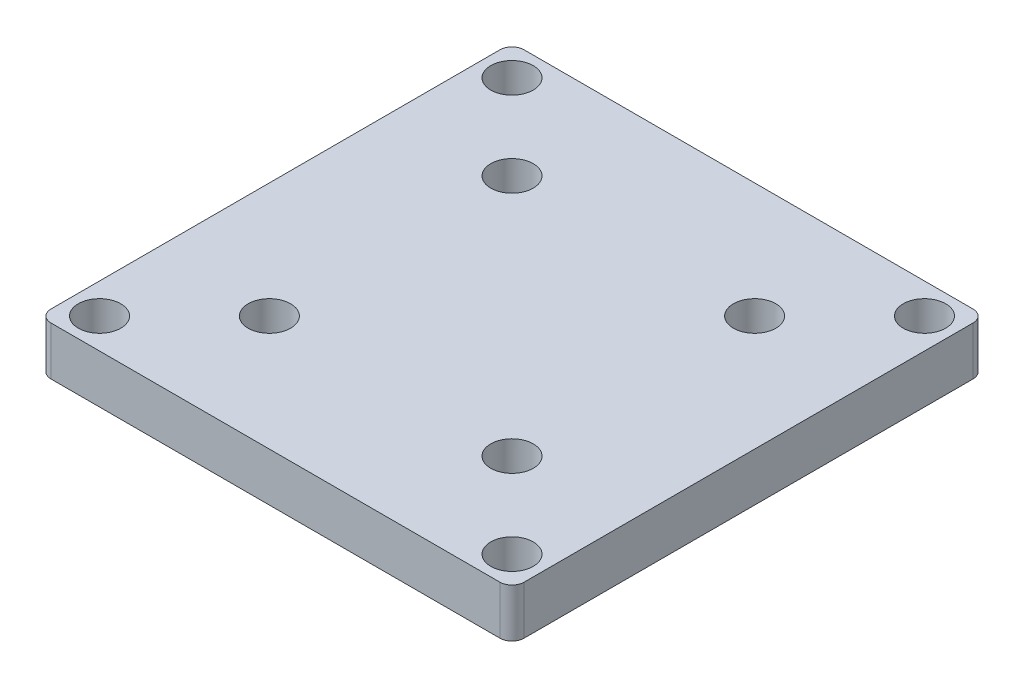
ISO-10303-21;
HEADER;
FILE_DESCRIPTION(('STEP AP214'),'2;1');
FILE_NAME('part.step','',(''),(''),'','','');
FILE_SCHEMA(('AUTOMOTIVE_DESIGN { 1 0 10303 214 1 1 1 1 }'));
ENDSEC;
DATA;
#1=APPLICATION_CONTEXT('core data for automotive mechanical design processes');
#2=APPLICATION_PROTOCOL_DEFINITION('international standard','automotive_design',2000,#1);
#3=PRODUCT_CONTEXT('',#1,'mechanical');
#4=PRODUCT('Part','Part','',(#3));
#5=PRODUCT_RELATED_PRODUCT_CATEGORY('part','',(#4));
#6=PRODUCT_DEFINITION_FORMATION('','',#4);
#7=PRODUCT_DEFINITION_CONTEXT('part definition',#1,'design');
#8=PRODUCT_DEFINITION('design','',#6,#7);
#9=PRODUCT_DEFINITION_SHAPE('','',#8);
#10=(LENGTH_UNIT() NAMED_UNIT(*) SI_UNIT(.MILLI.,.METRE.));
#11=(NAMED_UNIT(*) PLANE_ANGLE_UNIT() SI_UNIT($,.RADIAN.));
#12=(NAMED_UNIT(*) SI_UNIT($,.STERADIAN.) SOLID_ANGLE_UNIT());
#13=UNCERTAINTY_MEASURE_WITH_UNIT(LENGTH_MEASURE(1.E-05),#10,'distance_accuracy_value','');
#14=(GEOMETRIC_REPRESENTATION_CONTEXT(3) GLOBAL_UNCERTAINTY_ASSIGNED_CONTEXT((#13)) GLOBAL_UNIT_ASSIGNED_CONTEXT((#10,
#11,#12)) REPRESENTATION_CONTEXT('',''));
#15=CARTESIAN_POINT('',(0.,0.,0.));
#16=DIRECTION('',(0.,0.,1.));
#17=DIRECTION('',(1.,0.,0.));
#18=AXIS2_PLACEMENT_3D('',#15,#16,#17);
#19=CARTESIAN_POINT('',(0.,4.,0.));
#20=DIRECTION('',(0.,-1.,0.));
#21=DIRECTION('',(0.,0.,-1.));
#22=AXIS2_PLACEMENT_3D('',#19,#20,#21);
#23=PLANE('',#22);
#24=CARTESIAN_POINT('',(-10.,4.,-9.99999999999917));
#25=DIRECTION('',(0.,1.,0.));
#26=DIRECTION('',(0.,0.,1.));
#27=AXIS2_PLACEMENT_3D('',#24,#25,#26);
#28=CIRCLE('',#27,1.75);
#29=CARTESIAN_POINT('',(-10.,4.,-8.24999999999917));
#30=VERTEX_POINT('',#29);
#31=EDGE_CURVE('E217',#30,#30,#28,.T.);
#32=ORIENTED_EDGE('',*,*,#31,.F.);
#33=EDGE_LOOP('',(#32));
#34=FACE_BOUND('',#33,.T.);
#35=CARTESIAN_POINT('',(-9.99999999999917,4.,10.0000000000008));
#36=DIRECTION('',(0.,1.,0.));
#37=DIRECTION('',(0.,0.,1.));
#38=AXIS2_PLACEMENT_3D('',#35,#36,#37);
#39=CIRCLE('',#38,1.75);
#40=CARTESIAN_POINT('',(-9.99999999999917,4.,11.7500000000008));
#41=VERTEX_POINT('',#40);
#42=EDGE_CURVE('E220',#41,#41,#39,.T.);
#43=ORIENTED_EDGE('',*,*,#42,.F.);
#44=EDGE_LOOP('',(#43));
#45=FACE_BOUND('',#44,.T.);
#46=CARTESIAN_POINT('',(10.0000000000008,4.,10.));
#47=DIRECTION('',(0.,1.,0.));
#48=DIRECTION('',(0.,0.,1.));
#49=AXIS2_PLACEMENT_3D('',#46,#47,#48);
#50=CIRCLE('',#49,1.75);
#51=CARTESIAN_POINT('',(10.0000000000008,4.,11.75));
#52=VERTEX_POINT('',#51);
#53=EDGE_CURVE('E216',#52,#52,#50,.T.);
#54=ORIENTED_EDGE('',*,*,#53,.F.);
#55=EDGE_LOOP('',(#54));
#56=FACE_BOUND('',#55,.T.);
#57=CARTESIAN_POINT('',(10.,4.,-10.));
#58=DIRECTION('',(0.,1.,0.));
#59=DIRECTION('',(0.,0.,1.));
#60=AXIS2_PLACEMENT_3D('',#57,#58,#59);
#61=CIRCLE('',#60,1.75);
#62=CARTESIAN_POINT('',(10.,4.,-8.25));
#63=VERTEX_POINT('',#62);
#64=EDGE_CURVE('E145',#63,#63,#61,.T.);
#65=ORIENTED_EDGE('',*,*,#64,.F.);
#66=EDGE_LOOP('',(#65));
#67=FACE_BOUND('',#66,.T.);
#68=DIRECTION('',(0.,0.,1.));
#69=VECTOR('',#68,1.);
#70=CARTESIAN_POINT('',(-19.5,4.,19.5));
#71=LINE('',#70,#69);
#72=CARTESIAN_POINT('',(-19.5,4.,-18.5));
#73=VERTEX_POINT('',#72);
#74=CARTESIAN_POINT('',(-19.5,4.,18.5));
#75=VERTEX_POINT('',#74);
#76=EDGE_CURVE('E191',#73,#75,#71,.T.);
#77=ORIENTED_EDGE('',*,*,#76,.T.);
#78=CARTESIAN_POINT('',(-18.5,4.,18.5));
#79=DIRECTION('',(0.,-1.,0.));
#80=DIRECTION('',(0.,0.,-1.));
#81=AXIS2_PLACEMENT_3D('',#78,#79,#80);
#82=CIRCLE('',#81,1.);
#83=CARTESIAN_POINT('',(-18.5,4.,19.5));
#84=VERTEX_POINT('',#83);
#85=EDGE_CURVE('E168',#75,#84,#82,.F.);
#86=ORIENTED_EDGE('',*,*,#85,.T.);
#87=DIRECTION('',(1.,0.,0.));
#88=VECTOR('',#87,1.);
#89=CARTESIAN_POINT('',(-19.5,4.,19.5));
#90=LINE('',#89,#88);
#91=CARTESIAN_POINT('',(18.5,4.,19.5));
#92=VERTEX_POINT('',#91);
#93=EDGE_CURVE('E125',#84,#92,#90,.T.);
#94=ORIENTED_EDGE('',*,*,#93,.T.);
#95=CARTESIAN_POINT('',(18.5,4.,18.5));
#96=DIRECTION('',(0.,-1.,0.));
#97=DIRECTION('',(0.,0.,-1.));
#98=AXIS2_PLACEMENT_3D('',#95,#96,#97);
#99=CIRCLE('',#98,1.);
#100=CARTESIAN_POINT('',(19.5,4.,18.5));
#101=VERTEX_POINT('',#100);
#102=EDGE_CURVE('E163',#92,#101,#99,.F.);
#103=ORIENTED_EDGE('',*,*,#102,.T.);
#104=DIRECTION('',(0.,0.,-1.));
#105=VECTOR('',#104,1.);
#106=CARTESIAN_POINT('',(19.5,4.,19.5));
#107=LINE('',#106,#105);
#108=CARTESIAN_POINT('',(19.5,4.,-18.5));
#109=VERTEX_POINT('',#108);
#110=EDGE_CURVE('E132',#101,#109,#107,.T.);
#111=ORIENTED_EDGE('',*,*,#110,.T.);
#112=CARTESIAN_POINT('',(18.5,4.,-18.5));
#113=DIRECTION('',(0.,-1.,0.));
#114=DIRECTION('',(0.,0.,-1.));
#115=AXIS2_PLACEMENT_3D('',#112,#113,#114);
#116=CIRCLE('',#115,1.);
#117=CARTESIAN_POINT('',(18.5,4.,-19.5));
#118=VERTEX_POINT('',#117);
#119=EDGE_CURVE('E61',#109,#118,#116,.F.);
#120=ORIENTED_EDGE('',*,*,#119,.T.);
#121=DIRECTION('',(-1.,0.,0.));
#122=VECTOR('',#121,1.);
#123=CARTESIAN_POINT('',(-19.5,4.,-19.5));
#124=LINE('',#123,#122);
#125=CARTESIAN_POINT('',(-18.5,4.,-19.5));
#126=VERTEX_POINT('',#125);
#127=EDGE_CURVE('E135',#118,#126,#124,.T.);
#128=ORIENTED_EDGE('',*,*,#127,.T.);
#129=CARTESIAN_POINT('',(-18.5,4.,-18.5));
#130=DIRECTION('',(0.,-1.,0.));
#131=DIRECTION('',(0.,0.,-1.));
#132=AXIS2_PLACEMENT_3D('',#129,#130,#131);
#133=CIRCLE('',#132,1.);
#134=EDGE_CURVE('E166',#126,#73,#133,.F.);
#135=ORIENTED_EDGE('',*,*,#134,.T.);
#136=EDGE_LOOP('',(#77,#86,#94,#103,#111,#120,#128,#135));
#137=FACE_BOUND('',#136,.T.);
#138=CARTESIAN_POINT('',(17.,4.,-17.));
#139=DIRECTION('',(0.,1.,0.));
#140=DIRECTION('',(0.,0.,1.));
#141=AXIS2_PLACEMENT_3D('',#138,#139,#140);
#142=CIRCLE('',#141,1.75);
#143=CARTESIAN_POINT('',(17.,4.,-15.25));
#144=VERTEX_POINT('',#143);
#145=EDGE_CURVE('E184',#144,#144,#142,.T.);
#146=ORIENTED_EDGE('',*,*,#145,.F.);
#147=EDGE_LOOP('',(#146));
#148=FACE_BOUND('',#147,.T.);
#149=CARTESIAN_POINT('',(17.0000000000012,4.,17.));
#150=DIRECTION('',(0.,1.,0.));
#151=DIRECTION('',(0.,0.,1.));
#152=AXIS2_PLACEMENT_3D('',#149,#150,#151);
#153=CIRCLE('',#152,1.75);
#154=CARTESIAN_POINT('',(17.0000000000012,4.,18.75));
#155=VERTEX_POINT('',#154);
#156=EDGE_CURVE('E196',#155,#155,#153,.T.);
#157=ORIENTED_EDGE('',*,*,#156,.F.);
#158=EDGE_LOOP('',(#157));
#159=FACE_BOUND('',#158,.T.);
#160=CARTESIAN_POINT('',(-16.9999999999988,4.,17.0000000000012));
#161=DIRECTION('',(0.,1.,0.));
#162=DIRECTION('',(0.,0.,1.));
#163=AXIS2_PLACEMENT_3D('',#160,#161,#162);
#164=CIRCLE('',#163,1.75);
#165=CARTESIAN_POINT('',(-16.9999999999988,4.,18.7500000000012));
#166=VERTEX_POINT('',#165);
#167=EDGE_CURVE('E201',#166,#166,#164,.T.);
#168=ORIENTED_EDGE('',*,*,#167,.F.);
#169=EDGE_LOOP('',(#168));
#170=FACE_BOUND('',#169,.T.);
#171=CARTESIAN_POINT('',(-17.,4.,-16.9999999999988));
#172=DIRECTION('',(0.,1.,0.));
#173=DIRECTION('',(0.,0.,1.));
#174=AXIS2_PLACEMENT_3D('',#171,#172,#173);
#175=CIRCLE('',#174,1.75);
#176=CARTESIAN_POINT('',(-17.,4.,-15.2499999999988));
#177=VERTEX_POINT('',#176);
#178=EDGE_CURVE('E207',#177,#177,#175,.T.);
#179=ORIENTED_EDGE('',*,*,#178,.F.);
#180=EDGE_LOOP('',(#179));
#181=FACE_BOUND('',#180,.T.);
#182=ADVANCED_FACE('F39',(#34,#45,#56,#67,#137,#148,#159,#170,#181),#23,.F.);
#183=CARTESIAN_POINT('',(0.,0.,0.));
#184=DIRECTION('',(0.,-1.,0.));
#185=DIRECTION('',(0.,0.,-1.));
#186=AXIS2_PLACEMENT_3D('',#183,#184,#185);
#187=PLANE('',#186);
#188=CARTESIAN_POINT('',(-10.,0.,-9.99999999999917));
#189=DIRECTION('',(0.,-1.,0.));
#190=DIRECTION('',(0.,0.,-1.));
#191=AXIS2_PLACEMENT_3D('',#188,#189,#190);
#192=CIRCLE('',#191,1.75);
#193=CARTESIAN_POINT('',(-10.,0.,-11.7499999999992));
#194=VERTEX_POINT('',#193);
#195=EDGE_CURVE('E151',#194,#194,#192,.T.);
#196=ORIENTED_EDGE('',*,*,#195,.F.);
#197=EDGE_LOOP('',(#196));
#198=FACE_BOUND('',#197,.T.);
#199=CARTESIAN_POINT('',(-9.99999999999917,0.,10.0000000000008));
#200=DIRECTION('',(0.,-1.,0.));
#201=DIRECTION('',(0.,0.,-1.));
#202=AXIS2_PLACEMENT_3D('',#199,#200,#201);
#203=CIRCLE('',#202,1.75);
#204=CARTESIAN_POINT('',(-9.99999999999917,0.,8.25000000000083));
#205=VERTEX_POINT('',#204);
#206=EDGE_CURVE('E148',#205,#205,#203,.T.);
#207=ORIENTED_EDGE('',*,*,#206,.F.);
#208=EDGE_LOOP('',(#207));
#209=FACE_BOUND('',#208,.T.);
#210=CARTESIAN_POINT('',(10.0000000000008,0.,10.));
#211=DIRECTION('',(0.,-1.,0.));
#212=DIRECTION('',(0.,0.,-1.));
#213=AXIS2_PLACEMENT_3D('',#210,#211,#212);
#214=CIRCLE('',#213,1.75);
#215=CARTESIAN_POINT('',(10.0000000000008,0.,8.25000000000001));
#216=VERTEX_POINT('',#215);
#217=EDGE_CURVE('E144',#216,#216,#214,.T.);
#218=ORIENTED_EDGE('',*,*,#217,.F.);
#219=EDGE_LOOP('',(#218));
#220=FACE_BOUND('',#219,.T.);
#221=CARTESIAN_POINT('',(10.,0.,-10.));
#222=DIRECTION('',(0.,-1.,0.));
#223=DIRECTION('',(0.,0.,-1.));
#224=AXIS2_PLACEMENT_3D('',#221,#222,#223);
#225=CIRCLE('',#224,1.75);
#226=CARTESIAN_POINT('',(10.,0.,-11.75));
#227=VERTEX_POINT('',#226);
#228=EDGE_CURVE('E141',#227,#227,#225,.T.);
#229=ORIENTED_EDGE('',*,*,#228,.F.);
#230=EDGE_LOOP('',(#229));
#231=FACE_BOUND('',#230,.T.);
#232=CARTESIAN_POINT('',(-16.9999999999988,0.,17.0000000000012));
#233=DIRECTION('',(0.,1.,0.));
#234=DIRECTION('',(0.,0.,1.));
#235=AXIS2_PLACEMENT_3D('',#232,#233,#234);
#236=CIRCLE('',#235,1.75);
#237=CARTESIAN_POINT('',(-16.9999999999988,0.,18.7500000000012));
#238=VERTEX_POINT('',#237);
#239=EDGE_CURVE('E204',#238,#238,#236,.T.);
#240=ORIENTED_EDGE('',*,*,#239,.T.);
#241=EDGE_LOOP('',(#240));
#242=FACE_BOUND('',#241,.T.);
#243=CARTESIAN_POINT('',(17.,0.,-17.));
#244=DIRECTION('',(0.,1.,0.));
#245=DIRECTION('',(0.,0.,1.));
#246=AXIS2_PLACEMENT_3D('',#243,#244,#245);
#247=CIRCLE('',#246,1.75);
#248=CARTESIAN_POINT('',(17.,0.,-15.25));
#249=VERTEX_POINT('',#248);
#250=EDGE_CURVE('E187',#249,#249,#247,.T.);
#251=ORIENTED_EDGE('',*,*,#250,.T.);
#252=EDGE_LOOP('',(#251));
#253=FACE_BOUND('',#252,.T.);
#254=DIRECTION('',(1.,0.,0.));
#255=VECTOR('',#254,1.);
#256=CARTESIAN_POINT('',(-19.5,0.,19.5));
#257=LINE('',#256,#255);
#258=CARTESIAN_POINT('',(-18.5,0.,19.5));
#259=VERTEX_POINT('',#258);
#260=CARTESIAN_POINT('',(18.5,0.,19.5));
#261=VERTEX_POINT('',#260);
#262=EDGE_CURVE('E122',#259,#261,#257,.T.);
#263=ORIENTED_EDGE('',*,*,#262,.F.);
#264=CARTESIAN_POINT('',(-18.5,0.,18.5));
#265=DIRECTION('',(0.,-1.,0.));
#266=DIRECTION('',(0.,0.,-1.));
#267=AXIS2_PLACEMENT_3D('',#264,#265,#266);
#268=CIRCLE('',#267,1.);
#269=CARTESIAN_POINT('',(-19.5,0.,18.5));
#270=VERTEX_POINT('',#269);
#271=EDGE_CURVE('E105',#259,#270,#268,.T.);
#272=ORIENTED_EDGE('',*,*,#271,.T.);
#273=DIRECTION('',(0.,0.,1.));
#274=VECTOR('',#273,1.);
#275=CARTESIAN_POINT('',(-19.5,0.,19.5));
#276=LINE('',#275,#274);
#277=CARTESIAN_POINT('',(-19.5,0.,-18.5));
#278=VERTEX_POINT('',#277);
#279=EDGE_CURVE('E133',#278,#270,#276,.T.);
#280=ORIENTED_EDGE('',*,*,#279,.F.);
#281=CARTESIAN_POINT('',(-18.5,0.,-18.5));
#282=DIRECTION('',(0.,-1.,0.));
#283=DIRECTION('',(0.,0.,-1.));
#284=AXIS2_PLACEMENT_3D('',#281,#282,#283);
#285=CIRCLE('',#284,1.);
#286=CARTESIAN_POINT('',(-18.5,0.,-19.5));
#287=VERTEX_POINT('',#286);
#288=EDGE_CURVE('E116',#278,#287,#285,.T.);
#289=ORIENTED_EDGE('',*,*,#288,.T.);
#290=DIRECTION('',(-1.,0.,0.));
#291=VECTOR('',#290,1.);
#292=CARTESIAN_POINT('',(-19.5,0.,-19.5));
#293=LINE('',#292,#291);
#294=CARTESIAN_POINT('',(18.5,0.,-19.5));
#295=VERTEX_POINT('',#294);
#296=EDGE_CURVE('E137',#295,#287,#293,.T.);
#297=ORIENTED_EDGE('',*,*,#296,.F.);
#298=CARTESIAN_POINT('',(18.5,0.,-18.5));
#299=DIRECTION('',(0.,-1.,0.));
#300=DIRECTION('',(0.,0.,-1.));
#301=AXIS2_PLACEMENT_3D('',#298,#299,#300);
#302=CIRCLE('',#301,1.);
#303=CARTESIAN_POINT('',(19.5,0.,-18.5));
#304=VERTEX_POINT('',#303);
#305=EDGE_CURVE('E157',#295,#304,#302,.T.);
#306=ORIENTED_EDGE('',*,*,#305,.T.);
#307=DIRECTION('',(0.,0.,-1.));
#308=VECTOR('',#307,1.);
#309=CARTESIAN_POINT('',(19.5,0.,19.5));
#310=LINE('',#309,#308);
#311=CARTESIAN_POINT('',(19.5,0.,18.5));
#312=VERTEX_POINT('',#311);
#313=EDGE_CURVE('E179',#312,#304,#310,.T.);
#314=ORIENTED_EDGE('',*,*,#313,.F.);
#315=CARTESIAN_POINT('',(18.5,0.,18.5));
#316=DIRECTION('',(0.,-1.,0.));
#317=DIRECTION('',(0.,0.,-1.));
#318=AXIS2_PLACEMENT_3D('',#315,#316,#317);
#319=CIRCLE('',#318,1.);
#320=EDGE_CURVE('E126',#312,#261,#319,.T.);
#321=ORIENTED_EDGE('',*,*,#320,.T.);
#322=EDGE_LOOP('',(#263,#272,#280,#289,#297,#306,#314,#321));
#323=FACE_BOUND('',#322,.T.);
#324=CARTESIAN_POINT('',(17.0000000000012,0.,17.));
#325=DIRECTION('',(0.,1.,0.));
#326=DIRECTION('',(0.,0.,1.));
#327=AXIS2_PLACEMENT_3D('',#324,#325,#326);
#328=CIRCLE('',#327,1.75);
#329=CARTESIAN_POINT('',(17.0000000000012,0.,18.75));
#330=VERTEX_POINT('',#329);
#331=EDGE_CURVE('E198',#330,#330,#328,.T.);
#332=ORIENTED_EDGE('',*,*,#331,.T.);
#333=EDGE_LOOP('',(#332));
#334=FACE_BOUND('',#333,.T.);
#335=CARTESIAN_POINT('',(-17.,0.,-16.9999999999988));
#336=DIRECTION('',(0.,1.,0.));
#337=DIRECTION('',(0.,0.,1.));
#338=AXIS2_PLACEMENT_3D('',#335,#336,#337);
#339=CIRCLE('',#338,1.75);
#340=CARTESIAN_POINT('',(-17.,0.,-15.2499999999988));
#341=VERTEX_POINT('',#340);
#342=EDGE_CURVE('E154',#341,#341,#339,.T.);
#343=ORIENTED_EDGE('',*,*,#342,.T.);
#344=EDGE_LOOP('',(#343));
#345=FACE_BOUND('',#344,.T.);
#346=ADVANCED_FACE('F129',(#198,#209,#220,#231,#242,#253,#323,#334,#345),#187,.T.);
#347=CARTESIAN_POINT('',(19.5,4.,19.5));
#348=DIRECTION('',(-1.,0.,0.));
#349=DIRECTION('',(0.,0.,1.));
#350=AXIS2_PLACEMENT_3D('',#347,#348,#349);
#351=PLANE('',#350);
#352=ORIENTED_EDGE('',*,*,#313,.T.);
#353=DIRECTION('',(0.,-1.,0.));
#354=VECTOR('',#353,1.);
#355=CARTESIAN_POINT('',(19.5,4.,-18.5));
#356=LINE('',#355,#354);
#357=EDGE_CURVE('E11',#304,#109,#356,.F.);
#358=ORIENTED_EDGE('',*,*,#357,.T.);
#359=ORIENTED_EDGE('',*,*,#110,.F.);
#360=DIRECTION('',(0.,-1.,0.));
#361=VECTOR('',#360,1.);
#362=CARTESIAN_POINT('',(19.5,4.,18.5));
#363=LINE('',#362,#361);
#364=EDGE_CURVE('E47',#101,#312,#363,.T.);
#365=ORIENTED_EDGE('',*,*,#364,.T.);
#366=EDGE_LOOP('',(#352,#358,#359,#365));
#367=FACE_BOUND('',#366,.T.);
#368=ADVANCED_FACE('F178',(#367),#351,.F.);
#369=CARTESIAN_POINT('',(-19.5,4.,-19.5));
#370=DIRECTION('',(0.,0.,1.));
#371=DIRECTION('',(1.,0.,0.));
#372=AXIS2_PLACEMENT_3D('',#369,#370,#371);
#373=PLANE('',#372);
#374=ORIENTED_EDGE('',*,*,#296,.T.);
#375=DIRECTION('',(0.,-1.,0.));
#376=VECTOR('',#375,1.);
#377=CARTESIAN_POINT('',(-18.5,4.,-19.5));
#378=LINE('',#377,#376);
#379=EDGE_CURVE('E54',#287,#126,#378,.F.);
#380=ORIENTED_EDGE('',*,*,#379,.T.);
#381=ORIENTED_EDGE('',*,*,#127,.F.);
#382=DIRECTION('',(0.,-1.,0.));
#383=VECTOR('',#382,1.);
#384=CARTESIAN_POINT('',(18.5,4.,-19.5));
#385=LINE('',#384,#383);
#386=EDGE_CURVE('E170',#118,#295,#385,.T.);
#387=ORIENTED_EDGE('',*,*,#386,.T.);
#388=EDGE_LOOP('',(#374,#380,#381,#387));
#389=FACE_BOUND('',#388,.T.);
#390=ADVANCED_FACE('F257',(#389),#373,.F.);
#391=CARTESIAN_POINT('',(-19.5,4.,19.5));
#392=DIRECTION('',(1.,0.,0.));
#393=DIRECTION('',(0.,0.,-1.));
#394=AXIS2_PLACEMENT_3D('',#391,#392,#393);
#395=PLANE('',#394);
#396=ORIENTED_EDGE('',*,*,#279,.T.);
#397=DIRECTION('',(0.,-1.,0.));
#398=VECTOR('',#397,1.);
#399=CARTESIAN_POINT('',(-19.5,4.,18.5));
#400=LINE('',#399,#398);
#401=EDGE_CURVE('E110',#270,#75,#400,.F.);
#402=ORIENTED_EDGE('',*,*,#401,.T.);
#403=ORIENTED_EDGE('',*,*,#76,.F.);
#404=DIRECTION('',(0.,-1.,0.));
#405=VECTOR('',#404,1.);
#406=CARTESIAN_POINT('',(-19.5,4.,-18.5));
#407=LINE('',#406,#405);
#408=EDGE_CURVE('E115',#73,#278,#407,.T.);
#409=ORIENTED_EDGE('',*,*,#408,.T.);
#410=EDGE_LOOP('',(#396,#402,#403,#409));
#411=FACE_BOUND('',#410,.T.);
#412=ADVANCED_FACE('F266',(#411),#395,.F.);
#413=CARTESIAN_POINT('',(-19.5,4.,19.5));
#414=DIRECTION('',(0.,0.,-1.));
#415=DIRECTION('',(-1.,0.,0.));
#416=AXIS2_PLACEMENT_3D('',#413,#414,#415);
#417=PLANE('',#416);
#418=ORIENTED_EDGE('',*,*,#93,.F.);
#419=DIRECTION('',(0.,-1.,0.));
#420=VECTOR('',#419,1.);
#421=CARTESIAN_POINT('',(-18.5,4.,19.5));
#422=LINE('',#421,#420);
#423=EDGE_CURVE('E109',#84,#259,#422,.T.);
#424=ORIENTED_EDGE('',*,*,#423,.T.);
#425=ORIENTED_EDGE('',*,*,#262,.T.);
#426=DIRECTION('',(0.,-1.,0.));
#427=VECTOR('',#426,1.);
#428=CARTESIAN_POINT('',(18.5,4.,19.5));
#429=LINE('',#428,#427);
#430=EDGE_CURVE('E127',#261,#92,#429,.F.);
#431=ORIENTED_EDGE('',*,*,#430,.T.);
#432=EDGE_LOOP('',(#418,#424,#425,#431));
#433=FACE_BOUND('',#432,.T.);
#434=ADVANCED_FACE('F121',(#433),#417,.F.);
#435=CARTESIAN_POINT('',(17.,4.,-17.));
#436=DIRECTION('',(0.,-1.,0.));
#437=DIRECTION('',(0.,0.,-1.));
#438=AXIS2_PLACEMENT_3D('',#435,#436,#437);
#439=CYLINDRICAL_SURFACE('',#438,1.75);
#440=ORIENTED_EDGE('',*,*,#145,.T.);
#441=EDGE_LOOP('',(#440));
#442=FACE_BOUND('',#441,.T.);
#443=ORIENTED_EDGE('',*,*,#250,.F.);
#444=EDGE_LOOP('',(#443));
#445=FACE_BOUND('',#444,.T.);
#446=ADVANCED_FACE('F265',(#442,#445),#439,.F.);
#447=CARTESIAN_POINT('',(17.0000000000012,4.,17.));
#448=DIRECTION('',(0.,-1.,0.));
#449=DIRECTION('',(0.,0.,-1.));
#450=AXIS2_PLACEMENT_3D('',#447,#448,#449);
#451=CYLINDRICAL_SURFACE('',#450,1.75);
#452=ORIENTED_EDGE('',*,*,#156,.T.);
#453=EDGE_LOOP('',(#452));
#454=FACE_BOUND('',#453,.T.);
#455=ORIENTED_EDGE('',*,*,#331,.F.);
#456=EDGE_LOOP('',(#455));
#457=FACE_BOUND('',#456,.T.);
#458=ADVANCED_FACE('F393',(#454,#457),#451,.F.);
#459=CARTESIAN_POINT('',(-16.9999999999988,4.,17.0000000000012));
#460=DIRECTION('',(0.,-1.,0.));
#461=DIRECTION('',(0.,0.,-1.));
#462=AXIS2_PLACEMENT_3D('',#459,#460,#461);
#463=CYLINDRICAL_SURFACE('',#462,1.75);
#464=ORIENTED_EDGE('',*,*,#167,.T.);
#465=EDGE_LOOP('',(#464));
#466=FACE_BOUND('',#465,.T.);
#467=ORIENTED_EDGE('',*,*,#239,.F.);
#468=EDGE_LOOP('',(#467));
#469=FACE_BOUND('',#468,.T.);
#470=ADVANCED_FACE('F247',(#466,#469),#463,.F.);
#471=CARTESIAN_POINT('',(-17.,4.,-16.9999999999988));
#472=DIRECTION('',(0.,-1.,0.));
#473=DIRECTION('',(0.,0.,-1.));
#474=AXIS2_PLACEMENT_3D('',#471,#472,#473);
#475=CYLINDRICAL_SURFACE('',#474,1.75);
#476=ORIENTED_EDGE('',*,*,#178,.T.);
#477=EDGE_LOOP('',(#476));
#478=FACE_BOUND('',#477,.T.);
#479=ORIENTED_EDGE('',*,*,#342,.F.);
#480=EDGE_LOOP('',(#479));
#481=FACE_BOUND('',#480,.T.);
#482=ADVANCED_FACE('F243',(#478,#481),#475,.F.);
#483=CARTESIAN_POINT('',(10.,-7.,-10.));
#484=DIRECTION('',(0.,1.,0.));
#485=DIRECTION('',(0.,0.,1.));
#486=AXIS2_PLACEMENT_3D('',#483,#484,#485);
#487=CYLINDRICAL_SURFACE('',#486,1.75);
#488=ORIENTED_EDGE('',*,*,#228,.T.);
#489=EDGE_LOOP('',(#488));
#490=FACE_BOUND('',#489,.T.);
#491=ORIENTED_EDGE('',*,*,#64,.T.);
#492=EDGE_LOOP('',(#491));
#493=FACE_BOUND('',#492,.T.);
#494=ADVANCED_FACE('F246',(#490,#493),#487,.F.);
#495=CARTESIAN_POINT('',(10.0000000000008,-7.,10.));
#496=DIRECTION('',(0.,1.,0.));
#497=DIRECTION('',(0.,0.,1.));
#498=AXIS2_PLACEMENT_3D('',#495,#496,#497);
#499=CYLINDRICAL_SURFACE('',#498,1.75);
#500=ORIENTED_EDGE('',*,*,#217,.T.);
#501=EDGE_LOOP('',(#500));
#502=FACE_BOUND('',#501,.T.);
#503=ORIENTED_EDGE('',*,*,#53,.T.);
#504=EDGE_LOOP('',(#503));
#505=FACE_BOUND('',#504,.T.);
#506=ADVANCED_FACE('F226',(#502,#505),#499,.F.);
#507=CARTESIAN_POINT('',(-9.99999999999917,-7.,10.0000000000008));
#508=DIRECTION('',(0.,1.,0.));
#509=DIRECTION('',(0.,0.,1.));
#510=AXIS2_PLACEMENT_3D('',#507,#508,#509);
#511=CYLINDRICAL_SURFACE('',#510,1.75);
#512=ORIENTED_EDGE('',*,*,#206,.T.);
#513=EDGE_LOOP('',(#512));
#514=FACE_BOUND('',#513,.T.);
#515=ORIENTED_EDGE('',*,*,#42,.T.);
#516=EDGE_LOOP('',(#515));
#517=FACE_BOUND('',#516,.T.);
#518=ADVANCED_FACE('F350',(#514,#517),#511,.F.);
#519=CARTESIAN_POINT('',(-10.,-7.,-9.99999999999917));
#520=DIRECTION('',(0.,1.,0.));
#521=DIRECTION('',(0.,0.,1.));
#522=AXIS2_PLACEMENT_3D('',#519,#520,#521);
#523=CYLINDRICAL_SURFACE('',#522,1.75);
#524=ORIENTED_EDGE('',*,*,#195,.T.);
#525=EDGE_LOOP('',(#524));
#526=FACE_BOUND('',#525,.T.);
#527=ORIENTED_EDGE('',*,*,#31,.T.);
#528=EDGE_LOOP('',(#527));
#529=FACE_BOUND('',#528,.T.);
#530=ADVANCED_FACE('F275',(#526,#529),#523,.F.);
#531=CARTESIAN_POINT('',(-18.5,4.,18.5));
#532=DIRECTION('',(0.,-1.,0.));
#533=DIRECTION('',(0.,0.,-1.));
#534=AXIS2_PLACEMENT_3D('',#531,#532,#533);
#535=CYLINDRICAL_SURFACE('',#534,1.);
#536=ORIENTED_EDGE('',*,*,#85,.F.);
#537=ORIENTED_EDGE('',*,*,#401,.F.);
#538=ORIENTED_EDGE('',*,*,#271,.F.);
#539=ORIENTED_EDGE('',*,*,#423,.F.);
#540=EDGE_LOOP('',(#536,#537,#538,#539));
#541=FACE_BOUND('',#540,.T.);
#542=ADVANCED_FACE('F108',(#541),#535,.T.);
#543=CARTESIAN_POINT('',(-18.5,4.,-18.5));
#544=DIRECTION('',(0.,-1.,0.));
#545=DIRECTION('',(0.,0.,-1.));
#546=AXIS2_PLACEMENT_3D('',#543,#544,#545);
#547=CYLINDRICAL_SURFACE('',#546,1.);
#548=ORIENTED_EDGE('',*,*,#134,.F.);
#549=ORIENTED_EDGE('',*,*,#379,.F.);
#550=ORIENTED_EDGE('',*,*,#288,.F.);
#551=ORIENTED_EDGE('',*,*,#408,.F.);
#552=EDGE_LOOP('',(#548,#549,#550,#551));
#553=FACE_BOUND('',#552,.T.);
#554=ADVANCED_FACE('F274',(#553),#547,.T.);
#555=CARTESIAN_POINT('',(18.5,4.,-18.5));
#556=DIRECTION('',(0.,-1.,0.));
#557=DIRECTION('',(0.,0.,-1.));
#558=AXIS2_PLACEMENT_3D('',#555,#556,#557);
#559=CYLINDRICAL_SURFACE('',#558,1.);
#560=ORIENTED_EDGE('',*,*,#119,.F.);
#561=ORIENTED_EDGE('',*,*,#357,.F.);
#562=ORIENTED_EDGE('',*,*,#305,.F.);
#563=ORIENTED_EDGE('',*,*,#386,.F.);
#564=EDGE_LOOP('',(#560,#561,#562,#563));
#565=FACE_BOUND('',#564,.T.);
#566=ADVANCED_FACE('F277',(#565),#559,.T.);
#567=CARTESIAN_POINT('',(18.5,4.,18.5));
#568=DIRECTION('',(0.,-1.,0.));
#569=DIRECTION('',(0.,0.,-1.));
#570=AXIS2_PLACEMENT_3D('',#567,#568,#569);
#571=CYLINDRICAL_SURFACE('',#570,1.);
#572=ORIENTED_EDGE('',*,*,#102,.F.);
#573=ORIENTED_EDGE('',*,*,#430,.F.);
#574=ORIENTED_EDGE('',*,*,#320,.F.);
#575=ORIENTED_EDGE('',*,*,#364,.F.);
#576=EDGE_LOOP('',(#572,#573,#574,#575));
#577=FACE_BOUND('',#576,.T.);
#578=ADVANCED_FACE('F41',(#577),#571,.T.);
#579=CLOSED_SHELL('',(#182,#346,#368,#390,#412,#434,#446,#458,#470,#482,#494,#506,#518,#530,
#542,#554,#566,#578));
#580=MANIFOLD_SOLID_BREP('B2',#579);
#581=ADVANCED_BREP_SHAPE_REPRESENTATION('',(#18,#580),#14);
#582=SHAPE_DEFINITION_REPRESENTATION(#9,#581);
ENDSEC;
END-ISO-10303-21;
